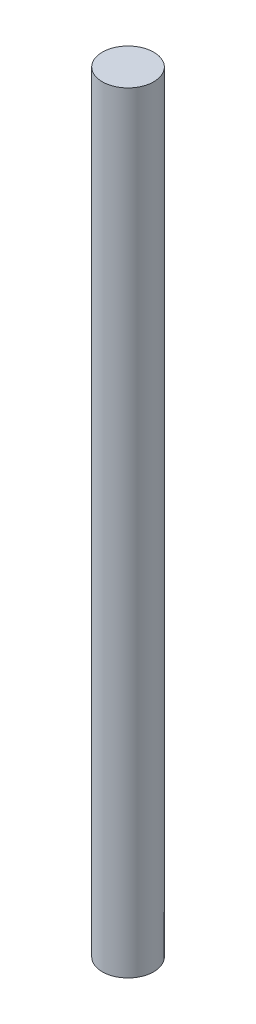
ISO-10303-21;
HEADER;
FILE_DESCRIPTION(('STEP AP214'),'2;1');
FILE_NAME('part.step','',(''),(''),'','','');
FILE_SCHEMA(('AUTOMOTIVE_DESIGN { 1 0 10303 214 1 1 1 1 }'));
ENDSEC;
DATA;
#1=APPLICATION_CONTEXT('core data for automotive mechanical design processes');
#2=APPLICATION_PROTOCOL_DEFINITION('international standard','automotive_design',2000,#1);
#3=PRODUCT_CONTEXT('',#1,'mechanical');
#4=PRODUCT('Part','Part','',(#3));
#5=PRODUCT_RELATED_PRODUCT_CATEGORY('part','',(#4));
#6=PRODUCT_DEFINITION_FORMATION('','',#4);
#7=PRODUCT_DEFINITION_CONTEXT('part definition',#1,'design');
#8=PRODUCT_DEFINITION('design','',#6,#7);
#9=PRODUCT_DEFINITION_SHAPE('','',#8);
#10=(LENGTH_UNIT() NAMED_UNIT(*) SI_UNIT(.MILLI.,.METRE.));
#11=(NAMED_UNIT(*) PLANE_ANGLE_UNIT() SI_UNIT($,.RADIAN.));
#12=(NAMED_UNIT(*) SI_UNIT($,.STERADIAN.) SOLID_ANGLE_UNIT());
#13=UNCERTAINTY_MEASURE_WITH_UNIT(LENGTH_MEASURE(1.E-05),#10,'distance_accuracy_value','');
#14=(GEOMETRIC_REPRESENTATION_CONTEXT(3) GLOBAL_UNCERTAINTY_ASSIGNED_CONTEXT((#13)) GLOBAL_UNIT_ASSIGNED_CONTEXT((#10,
#11,#12)) REPRESENTATION_CONTEXT('',''));
#15=CARTESIAN_POINT('',(0.,0.,0.));
#16=DIRECTION('',(0.,0.,1.));
#17=DIRECTION('',(1.,0.,0.));
#18=AXIS2_PLACEMENT_3D('',#15,#16,#17);
#19=CARTESIAN_POINT('',(0.,45.,0.));
#20=DIRECTION('',(0.,-1.,0.));
#21=DIRECTION('',(0.,0.,-1.));
#22=AXIS2_PLACEMENT_3D('',#19,#20,#21);
#23=CYLINDRICAL_SURFACE('',#22,1.5);
#24=CARTESIAN_POINT('',(0.,45.,0.));
#25=DIRECTION('',(0.,1.,0.));
#26=DIRECTION('',(0.,0.,1.));
#27=AXIS2_PLACEMENT_3D('',#24,#25,#26);
#28=CIRCLE('',#27,1.5);
#29=CARTESIAN_POINT('',(0.,45.,-1.5));
#30=VERTEX_POINT('',#29);
#31=EDGE_CURVE('E12',#30,#30,#28,.T.);
#32=CARTESIAN_POINT('',(0.,0.,0.));
#33=DIRECTION('',(0.,1.,0.));
#34=DIRECTION('',(0.,0.,1.));
#35=AXIS2_PLACEMENT_3D('',#32,#33,#34);
#36=CIRCLE('',#35,1.5);
#37=CARTESIAN_POINT('',(0.,0.,-1.5));
#38=VERTEX_POINT('',#37);
#39=EDGE_CURVE('E42',#38,#38,#36,.T.);
#40=CARTESIAN_POINT('',(0.,45.,-1.5));
#41=CARTESIAN_POINT('',(0.,44.53125,-1.5));
#42=CARTESIAN_POINT('',(0.,44.0625,-1.5));
#43=CARTESIAN_POINT('',(0.,43.125,-1.5));
#44=CARTESIAN_POINT('',(0.,42.65625,-1.5));
#45=CARTESIAN_POINT('',(0.,41.71875,-1.5));
#46=CARTESIAN_POINT('',(0.,41.25,-1.5));
#47=CARTESIAN_POINT('',(0.,40.3125,-1.5));
#48=CARTESIAN_POINT('',(0.,39.84375,-1.5));
#49=CARTESIAN_POINT('',(0.,38.90625,-1.5));
#50=CARTESIAN_POINT('',(0.,38.4375,-1.5));
#51=CARTESIAN_POINT('',(0.,37.5,-1.5));
#52=CARTESIAN_POINT('',(0.,37.03125,-1.5));
#53=CARTESIAN_POINT('',(0.,36.09375,-1.5));
#54=CARTESIAN_POINT('',(0.,35.625,-1.5));
#55=CARTESIAN_POINT('',(0.,34.6875,-1.5));
#56=CARTESIAN_POINT('',(0.,34.21875,-1.5));
#57=CARTESIAN_POINT('',(0.,33.28125,-1.5));
#58=CARTESIAN_POINT('',(0.,32.8125,-1.5));
#59=CARTESIAN_POINT('',(0.,31.875,-1.5));
#60=CARTESIAN_POINT('',(0.,31.40625,-1.5));
#61=CARTESIAN_POINT('',(0.,30.46875,-1.5));
#62=CARTESIAN_POINT('',(0.,30.,-1.5));
#63=CARTESIAN_POINT('',(0.,29.0625,-1.5));
#64=CARTESIAN_POINT('',(0.,28.59375,-1.5));
#65=CARTESIAN_POINT('',(0.,27.65625,-1.5));
#66=CARTESIAN_POINT('',(0.,27.1875,-1.5));
#67=CARTESIAN_POINT('',(0.,26.25,-1.5));
#68=CARTESIAN_POINT('',(0.,25.78125,-1.5));
#69=CARTESIAN_POINT('',(0.,24.84375,-1.5));
#70=CARTESIAN_POINT('',(0.,24.375,-1.5));
#71=CARTESIAN_POINT('',(0.,23.4375,-1.5));
#72=CARTESIAN_POINT('',(0.,22.96875,-1.5));
#73=CARTESIAN_POINT('',(0.,22.03125,-1.5));
#74=CARTESIAN_POINT('',(0.,21.5625,-1.5));
#75=CARTESIAN_POINT('',(0.,20.625,-1.5));
#76=CARTESIAN_POINT('',(0.,20.15625,-1.5));
#77=CARTESIAN_POINT('',(0.,19.21875,-1.5));
#78=CARTESIAN_POINT('',(0.,18.75,-1.5));
#79=CARTESIAN_POINT('',(0.,17.8125,-1.5));
#80=CARTESIAN_POINT('',(0.,17.34375,-1.5));
#81=CARTESIAN_POINT('',(0.,16.40625,-1.5));
#82=CARTESIAN_POINT('',(0.,15.9375,-1.5));
#83=CARTESIAN_POINT('',(0.,15.,-1.5));
#84=CARTESIAN_POINT('',(0.,14.53125,-1.5));
#85=CARTESIAN_POINT('',(0.,13.59375,-1.5));
#86=CARTESIAN_POINT('',(0.,13.125,-1.5));
#87=CARTESIAN_POINT('',(0.,12.1875,-1.5));
#88=CARTESIAN_POINT('',(0.,11.71875,-1.5));
#89=CARTESIAN_POINT('',(0.,10.78125,-1.5));
#90=CARTESIAN_POINT('',(0.,10.3125,-1.5));
#91=CARTESIAN_POINT('',(0.,9.37499999999999,-1.5));
#92=CARTESIAN_POINT('',(0.,8.90624999999999,-1.5));
#93=CARTESIAN_POINT('',(0.,7.96874999999999,-1.5));
#94=CARTESIAN_POINT('',(0.,7.5,-1.5));
#95=CARTESIAN_POINT('',(0.,6.56249999999999,-1.5));
#96=CARTESIAN_POINT('',(0.,6.09374999999999,-1.5));
#97=CARTESIAN_POINT('',(0.,5.15624999999999,-1.5));
#98=CARTESIAN_POINT('',(0.,4.68749999999999,-1.5));
#99=CARTESIAN_POINT('',(0.,3.74999999999999,-1.5));
#100=CARTESIAN_POINT('',(0.,3.28124999999999,-1.5));
#101=CARTESIAN_POINT('',(0.,2.34374999999999,-1.5));
#102=CARTESIAN_POINT('',(0.,1.87499999999999,-1.5));
#103=CARTESIAN_POINT('',(0.,0.937499999999992,-1.5));
#104=CARTESIAN_POINT('',(0.,0.468749999999993,-1.5));
#105=CARTESIAN_POINT('',(0.,0.,-1.5));
#106=B_SPLINE_CURVE_WITH_KNOTS('',3,(#40,#41,#42,#43,#44,#45,#46,#47,#48,#49,#50,#51,#52,#53,
#54,#55,#56,#57,#58,#59,#60,#61,#62,#63,#64,#65,#66,#67,#68,#69,#70,#71,#72,#73,#74,#75,#76,#77,
#78,#79,#80,#81,#82,#83,#84,#85,#86,#87,#88,#89,#90,#91,#92,#93,#94,#95,#96,#97,#98,#99,#100,
#101,#102,#103,#104,#105),.UNSPECIFIED.,.F.,.F.,(4,2,2,2,2,2,2,2,2,2,2,2,2,2,2,2,2,2,2,2,2,2,2,
2,2,2,2,2,2,2,2,2,4),(0.,1.40625,2.8125,4.21874999999999,5.625,7.03125,8.43749999999999,9.84375,
11.25,12.65625,14.0625,15.46875,16.875,18.28125,19.6875,21.09375,22.5,23.90625,25.3125,26.71875,
28.125,29.53125,30.9375,32.34375,33.75,35.15625,36.5625,37.96875,39.375,40.78125,42.1875,
43.59375,45.),.UNSPECIFIED.);
#107=EDGE_CURVE('BSEAM39',#30,#38,#106,.T.);
#108=ORIENTED_EDGE('',*,*,#31,.F.);
#109=ORIENTED_EDGE('',*,*,#39,.T.);
#110=ORIENTED_EDGE('',*,*,#107,.T.);
#111=ORIENTED_EDGE('',*,*,#107,.F.);
#112=EDGE_LOOP('',(#108,#110,#109,#111));
#113=FACE_BOUND('',#112,.T.);
#114=ADVANCED_FACE('F39',(#113),#23,.T.);
#115=CARTESIAN_POINT('',(0.,45.,0.));
#116=DIRECTION('',(0.,1.,0.));
#117=DIRECTION('',(0.,0.,1.));
#118=AXIS2_PLACEMENT_3D('',#115,#116,#117);
#119=PLANE('',#118);
#120=ORIENTED_EDGE('',*,*,#31,.T.);
#121=EDGE_LOOP('',(#120));
#122=FACE_BOUND('',#121,.T.);
#123=ADVANCED_FACE('F54',(#122),#119,.T.);
#124=CARTESIAN_POINT('',(0.,0.,0.));
#125=DIRECTION('',(0.,1.,0.));
#126=DIRECTION('',(0.,0.,1.));
#127=AXIS2_PLACEMENT_3D('',#124,#125,#126);
#128=PLANE('',#127);
#129=ORIENTED_EDGE('',*,*,#39,.F.);
#130=EDGE_LOOP('',(#129));
#131=FACE_BOUND('',#130,.T.);
#132=ADVANCED_FACE('F52',(#131),#128,.F.);
#133=CLOSED_SHELL('',(#114,#123,#132));
#134=MANIFOLD_SOLID_BREP('B2',#133);
#135=ADVANCED_BREP_SHAPE_REPRESENTATION('',(#18,#134),#14);
#136=SHAPE_DEFINITION_REPRESENTATION(#9,#135);
ENDSEC;
END-ISO-10303-21;
